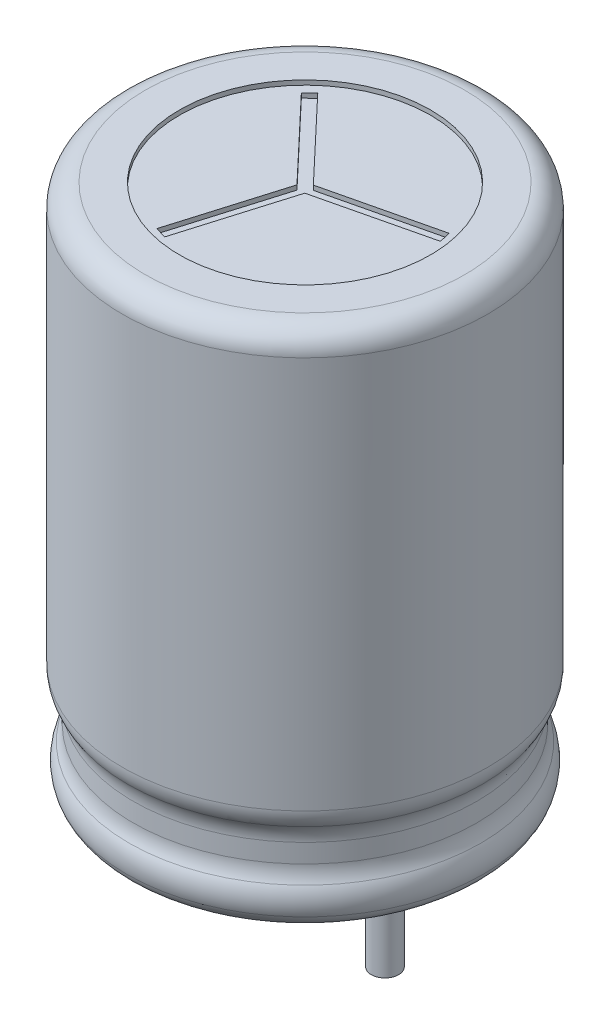
ISO-10303-21;
HEADER;
FILE_DESCRIPTION(('STEP AP214'),'2;1');
FILE_NAME('part.step','',(''),(''),'','','');
FILE_SCHEMA(('AUTOMOTIVE_DESIGN { 1 0 10303 214 1 1 1 1 }'));
ENDSEC;
DATA;
#1=APPLICATION_CONTEXT('core data for automotive mechanical design processes');
#2=APPLICATION_PROTOCOL_DEFINITION('international standard','automotive_design',2000,#1);
#3=PRODUCT_CONTEXT('',#1,'mechanical');
#4=PRODUCT('Part','Part','',(#3));
#5=PRODUCT_RELATED_PRODUCT_CATEGORY('part','',(#4));
#6=PRODUCT_DEFINITION_FORMATION('','',#4);
#7=PRODUCT_DEFINITION_CONTEXT('part definition',#1,'design');
#8=PRODUCT_DEFINITION('design','',#6,#7);
#9=PRODUCT_DEFINITION_SHAPE('','',#8);
#10=(LENGTH_UNIT() NAMED_UNIT(*) SI_UNIT(.MILLI.,.METRE.));
#11=(NAMED_UNIT(*) PLANE_ANGLE_UNIT() SI_UNIT($,.RADIAN.));
#12=(NAMED_UNIT(*) SI_UNIT($,.STERADIAN.) SOLID_ANGLE_UNIT());
#13=UNCERTAINTY_MEASURE_WITH_UNIT(LENGTH_MEASURE(1.E-05),#10,'distance_accuracy_value','');
#14=(GEOMETRIC_REPRESENTATION_CONTEXT(3) GLOBAL_UNCERTAINTY_ASSIGNED_CONTEXT((#13)) GLOBAL_UNIT_ASSIGNED_CONTEXT((#10,
#11,#12)) REPRESENTATION_CONTEXT('',''));
#15=CARTESIAN_POINT('',(0.,0.,0.));
#16=DIRECTION('',(0.,0.,1.));
#17=DIRECTION('',(1.,0.,0.));
#18=AXIS2_PLACEMENT_3D('',#15,#16,#17);
#19=CARTESIAN_POINT('',(0.,11.5,0.));
#20=DIRECTION('',(0.,-1.,0.));
#21=DIRECTION('',(1.,0.,0.));
#22=AXIS2_PLACEMENT_3D('',#19,#20,#21);
#23=CYLINDRICAL_SURFACE('',#22,4.);
#24=CARTESIAN_POINT('',(0.,11.,0.));
#25=DIRECTION('',(0.,1.,0.));
#26=DIRECTION('',(-1.,0.,0.));
#27=AXIS2_PLACEMENT_3D('',#24,#25,#26);
#28=CIRCLE('',#27,4.);
#29=CARTESIAN_POINT('',(-4.,11.,0.));
#30=VERTEX_POINT('',#29);
#31=EDGE_CURVE('E203',#30,#30,#28,.F.);
#32=ORIENTED_EDGE('',*,*,#31,.T.);
#33=EDGE_LOOP('',(#32));
#34=FACE_BOUND('',#33,.T.);
#35=CARTESIAN_POINT('',(0.,2.40756880196224,0.));
#36=DIRECTION('',(0.,-1.,0.));
#37=DIRECTION('',(1.,0.,0.));
#38=AXIS2_PLACEMENT_3D('',#35,#36,#37);
#39=CIRCLE('',#38,4.);
#40=CARTESIAN_POINT('',(4.,2.40756880196224,0.));
#41=VERTEX_POINT('',#40);
#42=EDGE_CURVE('E180',#41,#41,#39,.T.);
#43=ORIENTED_EDGE('',*,*,#42,.F.);
#44=EDGE_LOOP('',(#43));
#45=FACE_BOUND('',#44,.T.);
#46=ADVANCED_FACE('F35',(#34,#45),#23,.T.);
#47=CARTESIAN_POINT('',(4.,11.5,0.));
#48=DIRECTION('',(0.,1.,0.));
#49=DIRECTION('',(-1.,0.,0.));
#50=AXIS2_PLACEMENT_3D('',#47,#48,#49);
#51=PLANE('',#50);
#52=CARTESIAN_POINT('',(0.,11.5,0.));
#53=DIRECTION('',(0.,1.,0.));
#54=DIRECTION('',(-1.,0.,0.));
#55=AXIS2_PLACEMENT_3D('',#52,#53,#54);
#56=CIRCLE('',#55,3.5);
#57=CARTESIAN_POINT('',(-3.5,11.5,0.));
#58=VERTEX_POINT('',#57);
#59=EDGE_CURVE('E206',#58,#58,#56,.T.);
#60=ORIENTED_EDGE('',*,*,#59,.T.);
#61=EDGE_LOOP('',(#60));
#62=FACE_BOUND('',#61,.T.);
#63=CARTESIAN_POINT('',(0.,11.5,0.));
#64=DIRECTION('',(0.,1.,0.));
#65=DIRECTION('',(0.,0.,-1.));
#66=AXIS2_PLACEMENT_3D('',#63,#64,#65);
#67=CIRCLE('',#66,2.75);
#68=CARTESIAN_POINT('',(0.,11.5,-2.75));
#69=VERTEX_POINT('',#68);
#70=EDGE_CURVE('E165',#69,#69,#67,.T.);
#71=ORIENTED_EDGE('',*,*,#70,.F.);
#72=EDGE_LOOP('',(#71));
#73=FACE_BOUND('',#72,.T.);
#74=ADVANCED_FACE('F224',(#62,#73),#51,.T.);
#75=CARTESIAN_POINT('',(0.,0.,0.));
#76=DIRECTION('',(0.,-1.,0.));
#77=DIRECTION('',(1.,0.,0.));
#78=AXIS2_PLACEMENT_3D('',#75,#76,#77);
#79=PLANE('',#78);
#80=CARTESIAN_POINT('',(0.,0.,0.));
#81=DIRECTION('',(0.,-1.,0.));
#82=DIRECTION('',(1.,0.,0.));
#83=AXIS2_PLACEMENT_3D('',#80,#81,#82);
#84=CIRCLE('',#83,3.43222217734238);
#85=CARTESIAN_POINT('',(3.43222217734238,0.,0.));
#86=VERTEX_POINT('',#85);
#87=EDGE_CURVE('E43',#86,#86,#84,.T.);
#88=ORIENTED_EDGE('',*,*,#87,.T.);
#89=EDGE_LOOP('',(#88));
#90=FACE_BOUND('',#89,.T.);
#91=CARTESIAN_POINT('',(-1.75,0.,0.));
#92=DIRECTION('',(0.,-1.,0.));
#93=DIRECTION('',(1.,0.,0.));
#94=AXIS2_PLACEMENT_3D('',#91,#92,#93);
#95=CIRCLE('',#94,0.3);
#96=CARTESIAN_POINT('',(-1.45,0.,0.));
#97=VERTEX_POINT('',#96);
#98=EDGE_CURVE('E200',#97,#97,#95,.T.);
#99=ORIENTED_EDGE('',*,*,#98,.F.);
#100=EDGE_LOOP('',(#99));
#101=FACE_BOUND('',#100,.T.);
#102=CARTESIAN_POINT('',(1.75,0.,0.));
#103=DIRECTION('',(0.,-1.,0.));
#104=DIRECTION('',(1.,0.,0.));
#105=AXIS2_PLACEMENT_3D('',#102,#103,#104);
#106=CIRCLE('',#105,0.3);
#107=CARTESIAN_POINT('',(2.05,0.,0.));
#108=VERTEX_POINT('',#107);
#109=EDGE_CURVE('E197',#108,#108,#106,.T.);
#110=ORIENTED_EDGE('',*,*,#109,.F.);
#111=EDGE_LOOP('',(#110));
#112=FACE_BOUND('',#111,.T.);
#113=ADVANCED_FACE('F211',(#90,#101,#112),#79,.T.);
#114=CARTESIAN_POINT('',(0.,0.557977491137765,0.));
#115=DIRECTION('',(0.,-1.,0.));
#116=DIRECTION('',(1.,0.,0.));
#117=AXIS2_PLACEMENT_3D('',#114,#115,#116);
#118=TOROIDAL_SURFACE('',#117,3.27152793880487,0.670833333333335);
#119=CARTESIAN_POINT('',(0.,0.330309782035807,0.));
#120=DIRECTION('',(0.,1.,0.));
#121=DIRECTION('',(-1.,0.,0.));
#122=AXIS2_PLACEMENT_3D('',#119,#120,#121);
#123=CIRCLE('',#122,3.90254677793996);
#124=CARTESIAN_POINT('',(-3.90254677793995,0.330309782035806,0.));
#125=VERTEX_POINT('',#124);
#126=EDGE_CURVE('E11',#125,#125,#123,.T.);
#127=ORIENTED_EDGE('',*,*,#126,.T.);
#128=EDGE_LOOP('',(#127));
#129=FACE_BOUND('',#128,.T.);
#130=CARTESIAN_POINT('',(0.,0.895288247422594,0.));
#131=DIRECTION('',(0.,-1.,0.));
#132=DIRECTION('',(1.,0.,0.));
#133=AXIS2_PLACEMENT_3D('',#130,#131,#132);
#134=CIRCLE('',#133,3.85138896940244);
#135=CARTESIAN_POINT('',(3.85138896940244,0.895288247422594,0.));
#136=VERTEX_POINT('',#135);
#137=EDGE_CURVE('E194',#136,#136,#134,.T.);
#138=ORIENTED_EDGE('',*,*,#137,.T.);
#139=EDGE_LOOP('',(#138));
#140=FACE_BOUND('',#139,.T.);
#141=ADVANCED_FACE('F236',(#129,#140),#118,.T.);
#142=CARTESIAN_POINT('',(0.,1.23259900370742,0.));
#143=DIRECTION('',(0.,-1.,0.));
#144=DIRECTION('',(1.,0.,0.));
#145=AXIS2_PLACEMENT_3D('',#142,#143,#144);
#146=TOROIDAL_SURFACE('',#145,4.43125,0.670833333333332);
#147=CARTESIAN_POINT('',(0.,1.23259900370742,0.));
#148=DIRECTION('',(0.,-1.,0.));
#149=DIRECTION('',(1.,0.,0.));
#150=AXIS2_PLACEMENT_3D('',#147,#148,#149);
#151=CIRCLE('',#150,3.76041666666667);
#152=CARTESIAN_POINT('',(3.76041666666667,1.23259900370742,0.));
#153=VERTEX_POINT('',#152);
#154=EDGE_CURVE('E191',#153,#153,#151,.T.);
#155=ORIENTED_EDGE('',*,*,#154,.T.);
#156=EDGE_LOOP('',(#155));
#157=FACE_BOUND('',#156,.T.);
#158=ORIENTED_EDGE('',*,*,#137,.F.);
#159=EDGE_LOOP('',(#158));
#160=FACE_BOUND('',#159,.T.);
#161=ADVANCED_FACE('F239',(#157,#160),#146,.F.);
#162=CARTESIAN_POINT('',(0.,11.5,0.));
#163=DIRECTION('',(0.,-1.,0.));
#164=DIRECTION('',(1.,0.,0.));
#165=AXIS2_PLACEMENT_3D('',#162,#163,#164);
#166=CYLINDRICAL_SURFACE('',#165,3.76041666666667);
#167=CARTESIAN_POINT('',(0.,1.64240099629258,0.));
#168=DIRECTION('',(0.,-1.,0.));
#169=DIRECTION('',(1.,0.,0.));
#170=AXIS2_PLACEMENT_3D('',#167,#168,#169);
#171=CIRCLE('',#170,3.76041666666667);
#172=CARTESIAN_POINT('',(3.76041666666667,1.64240099629258,0.));
#173=VERTEX_POINT('',#172);
#174=EDGE_CURVE('E188',#173,#173,#171,.T.);
#175=ORIENTED_EDGE('',*,*,#174,.T.);
#176=EDGE_LOOP('',(#175));
#177=FACE_BOUND('',#176,.T.);
#178=ORIENTED_EDGE('',*,*,#154,.F.);
#179=EDGE_LOOP('',(#178));
#180=FACE_BOUND('',#179,.T.);
#181=ADVANCED_FACE('F243',(#177,#180),#166,.T.);
#182=CARTESIAN_POINT('',(0.,1.64240099629258,0.));
#183=DIRECTION('',(0.,-1.,0.));
#184=DIRECTION('',(1.,0.,0.));
#185=AXIS2_PLACEMENT_3D('',#182,#183,#184);
#186=TOROIDAL_SURFACE('',#185,4.43125,0.670833333333335);
#187=CARTESIAN_POINT('',(0.,2.02498489912741,0.));
#188=DIRECTION('',(0.,-1.,0.));
#189=DIRECTION('',(1.,0.,0.));
#190=AXIS2_PLACEMENT_3D('',#187,#188,#189);
#191=CIRCLE('',#190,3.88020833333333);
#192=CARTESIAN_POINT('',(3.88020833333333,2.02498489912741,0.));
#193=VERTEX_POINT('',#192);
#194=EDGE_CURVE('E185',#193,#193,#191,.T.);
#195=ORIENTED_EDGE('',*,*,#194,.T.);
#196=EDGE_LOOP('',(#195));
#197=FACE_BOUND('',#196,.T.);
#198=ORIENTED_EDGE('',*,*,#174,.F.);
#199=EDGE_LOOP('',(#198));
#200=FACE_BOUND('',#199,.T.);
#201=ADVANCED_FACE('F247',(#197,#200),#186,.F.);
#202=CARTESIAN_POINT('',(0.,2.40756880196224,0.));
#203=DIRECTION('',(0.,-1.,0.));
#204=DIRECTION('',(1.,0.,0.));
#205=AXIS2_PLACEMENT_3D('',#202,#203,#204);
#206=TOROIDAL_SURFACE('',#205,3.32916666666667,0.670833333333331);
#207=ORIENTED_EDGE('',*,*,#42,.T.);
#208=EDGE_LOOP('',(#207));
#209=FACE_BOUND('',#208,.T.);
#210=ORIENTED_EDGE('',*,*,#194,.F.);
#211=EDGE_LOOP('',(#210));
#212=FACE_BOUND('',#211,.T.);
#213=ADVANCED_FACE('F251',(#209,#212),#206,.T.);
#214=CARTESIAN_POINT('',(0.,11.4,0.));
#215=DIRECTION('',(0.,1.,0.));
#216=DIRECTION('',(0.,0.,1.));
#217=AXIS2_PLACEMENT_3D('',#214,#215,#216);
#218=CYLINDRICAL_SURFACE('',#217,2.75);
#219=CARTESIAN_POINT('',(0.,11.4,0.));
#220=DIRECTION('',(0.,1.,0.));
#221=DIRECTION('',(0.,0.,-1.));
#222=AXIS2_PLACEMENT_3D('',#219,#220,#221);
#223=CIRCLE('',#222,2.75);
#224=CARTESIAN_POINT('',(0.,11.4,-2.75));
#225=VERTEX_POINT('',#224);
#226=EDGE_CURVE('E177',#225,#225,#223,.T.);
#227=ORIENTED_EDGE('',*,*,#226,.F.);
#228=EDGE_LOOP('',(#227));
#229=FACE_BOUND('',#228,.T.);
#230=ORIENTED_EDGE('',*,*,#70,.T.);
#231=EDGE_LOOP('',(#230));
#232=FACE_BOUND('',#231,.T.);
#233=ADVANCED_FACE('F255',(#229,#232),#218,.F.);
#234=CARTESIAN_POINT('',(0.,11.4,0.));
#235=DIRECTION('',(0.,-1.,0.));
#236=DIRECTION('',(0.,0.,-1.));
#237=AXIS2_PLACEMENT_3D('',#234,#235,#236);
#238=PLANE('',#237);
#239=DIRECTION('',(-0.72638071356326,0.,0.687292557040545));
#240=VECTOR('',#239,1.);
#241=CARTESIAN_POINT('',(-1.65347274426045,11.4,-1.93229316719483));
#242=LINE('',#241,#240);
#243=CARTESIAN_POINT('',(-1.65347274426045,11.4,-1.93229316719483));
#244=VERTEX_POINT('',#243);
#245=CARTESIAN_POINT('',(-1.83797344550552,11.4,-1.75772085770653));
#246=VERTEX_POINT('',#245);
#247=EDGE_CURVE('E142',#244,#246,#242,.T.);
#248=ORIENTED_EDGE('',*,*,#247,.F.);
#249=DIRECTION('',(-0.687292557040545,0.,-0.726380713563259));
#250=VECTOR('',#249,1.);
#251=CARTESIAN_POINT('',(0.0418556656844723,11.4,-0.140546919508906));
#252=LINE('',#251,#250);
#253=CARTESIAN_POINT('',(0.0418556656844723,11.4,-0.140546919508906));
#254=VERTEX_POINT('',#253);
#255=EDGE_CURVE('E50',#254,#244,#252,.T.);
#256=ORIENTED_EDGE('',*,*,#255,.F.);
#257=DIRECTION('',(-0.972710429285124,0.,0.232022457447443));
#258=VECTOR('',#257,1.);
#259=CARTESIAN_POINT('',(2.44121763828839,11.4,-0.712871266435717));
#260=LINE('',#259,#258);
#261=CARTESIAN_POINT('',(2.44121763828839,11.4,-0.712871266435717));
#262=VERTEX_POINT('',#261);
#263=EDGE_CURVE('E161',#262,#254,#260,.T.);
#264=ORIENTED_EDGE('',*,*,#263,.F.);
#265=DIRECTION('',(-0.232022457447444,0.,-0.972710429285123));
#266=VECTOR('',#265,1.);
#267=CARTESIAN_POINT('',(2.50015134248004,11.4,-0.465802817397295));
#268=LINE('',#267,#266);
#269=CARTESIAN_POINT('',(2.50015134248004,11.4,-0.465802817397295));
#270=VERTEX_POINT('',#269);
#271=EDGE_CURVE('E159',#270,#262,#268,.T.);
#272=ORIENTED_EDGE('',*,*,#271,.F.);
#273=DIRECTION('',(0.972710429285124,0.,-0.232022457447443));
#274=VECTOR('',#273,1.);
#275=CARTESIAN_POINT('',(0.100789369876124,11.4,0.106521529529515));
#276=LINE('',#275,#274);
#277=CARTESIAN_POINT('',(0.100789369876124,11.4,0.106521529529515));
#278=VERTEX_POINT('',#277);
#279=EDGE_CURVE('E116',#278,#270,#276,.T.);
#280=ORIENTED_EDGE('',*,*,#279,.F.);
#281=DIRECTION('',(0.285417872244573,0.,-0.958403171010708));
#282=VECTOR('',#281,1.);
#283=CARTESIAN_POINT('',(-0.603244192782856,11.4,2.47059212414226));
#284=LINE('',#283,#282);
#285=CARTESIAN_POINT('',(-0.603244192782856,11.4,2.47059212414226));
#286=VERTEX_POINT('',#285);
#287=EDGE_CURVE('E155',#286,#278,#284,.T.);
#288=ORIENTED_EDGE('',*,*,#287,.F.);
#289=DIRECTION('',(0.958403171010708,0.,0.285417872244573));
#290=VECTOR('',#289,1.);
#291=CARTESIAN_POINT('',(-0.846678598219576,11.4,2.39809598459214));
#292=LINE('',#291,#290);
#293=CARTESIAN_POINT('',(-0.846678598219576,11.4,2.39809598459214));
#294=VERTEX_POINT('',#293);
#295=EDGE_CURVE('E152',#294,#286,#292,.T.);
#296=ORIENTED_EDGE('',*,*,#295,.F.);
#297=DIRECTION('',(-0.285417872244573,0.,0.958403171010708));
#298=VECTOR('',#297,1.);
#299=CARTESIAN_POINT('',(-0.142645035560596,11.4,0.0340253899793922));
#300=LINE('',#299,#298);
#301=CARTESIAN_POINT('',(-0.142645035560596,11.4,0.0340253899793922));
#302=VERTEX_POINT('',#301);
#303=EDGE_CURVE('E149',#302,#294,#300,.T.);
#304=ORIENTED_EDGE('',*,*,#303,.F.);
#305=DIRECTION('',(0.687292557040545,0.,0.726380713563259));
#306=VECTOR('',#305,1.);
#307=CARTESIAN_POINT('',(-1.83797344550552,11.4,-1.75772085770653));
#308=LINE('',#307,#306);
#309=EDGE_CURVE('E146',#246,#302,#308,.T.);
#310=ORIENTED_EDGE('',*,*,#309,.F.);
#311=EDGE_LOOP('',(#248,#256,#264,#272,#280,#288,#296,#304,#310));
#312=FACE_BOUND('',#311,.T.);
#313=ORIENTED_EDGE('',*,*,#226,.T.);
#314=EDGE_LOOP('',(#313));
#315=FACE_BOUND('',#314,.T.);
#316=ADVANCED_FACE('F259',(#312,#315),#238,.F.);
#317=CARTESIAN_POINT('',(0.0418556656844723,11.3,-0.140546919508906));
#318=DIRECTION('',(0.726380713563259,0.,-0.687292557040545));
#319=DIRECTION('',(-0.687292557040545,0.,-0.726380713563259));
#320=AXIS2_PLACEMENT_3D('',#317,#318,#319);
#321=PLANE('',#320);
#322=ORIENTED_EDGE('',*,*,#255,.T.);
#323=DIRECTION('',(0.,1.,0.));
#324=VECTOR('',#323,1.);
#325=CARTESIAN_POINT('',(-1.65347274426045,11.3,-1.93229316719483));
#326=LINE('',#325,#324);
#327=CARTESIAN_POINT('',(-1.65347274426045,11.3,-1.93229316719483));
#328=VERTEX_POINT('',#327);
#329=EDGE_CURVE('E89',#328,#244,#326,.T.);
#330=ORIENTED_EDGE('',*,*,#329,.F.);
#331=DIRECTION('',(-0.687292557040545,0.,-0.726380713563259));
#332=VECTOR('',#331,1.);
#333=CARTESIAN_POINT('',(0.0418556656844723,11.3,-0.140546919508906));
#334=LINE('',#333,#332);
#335=CARTESIAN_POINT('',(0.0418556656844723,11.3,-0.140546919508906));
#336=VERTEX_POINT('',#335);
#337=EDGE_CURVE('E163',#336,#328,#334,.T.);
#338=ORIENTED_EDGE('',*,*,#337,.F.);
#339=DIRECTION('',(0.,1.,0.));
#340=VECTOR('',#339,1.);
#341=CARTESIAN_POINT('',(0.0418556656844723,11.3,-0.140546919508906));
#342=LINE('',#341,#340);
#343=EDGE_CURVE('E58',#336,#254,#342,.T.);
#344=ORIENTED_EDGE('',*,*,#343,.T.);
#345=EDGE_LOOP('',(#322,#330,#338,#344));
#346=FACE_BOUND('',#345,.T.);
#347=ADVANCED_FACE('F263',(#346),#321,.F.);
#348=CARTESIAN_POINT('',(2.44121763828839,11.3,-0.712871266435717));
#349=DIRECTION('',(-0.232022457447443,0.,-0.972710429285124));
#350=DIRECTION('',(-0.972710429285124,0.,0.232022457447443));
#351=AXIS2_PLACEMENT_3D('',#348,#349,#350);
#352=PLANE('',#351);
#353=ORIENTED_EDGE('',*,*,#263,.T.);
#354=ORIENTED_EDGE('',*,*,#343,.F.);
#355=DIRECTION('',(-0.972710429285124,0.,0.232022457447443));
#356=VECTOR('',#355,1.);
#357=CARTESIAN_POINT('',(2.44121763828839,11.3,-0.712871266435717));
#358=LINE('',#357,#356);
#359=CARTESIAN_POINT('',(2.44121763828839,11.3,-0.712871266435717));
#360=VERTEX_POINT('',#359);
#361=EDGE_CURVE('E128',#360,#336,#358,.T.);
#362=ORIENTED_EDGE('',*,*,#361,.F.);
#363=DIRECTION('',(0.,1.,0.));
#364=VECTOR('',#363,1.);
#365=CARTESIAN_POINT('',(2.44121763828839,11.3,-0.712871266435717));
#366=LINE('',#365,#364);
#367=EDGE_CURVE('E120',#360,#262,#366,.T.);
#368=ORIENTED_EDGE('',*,*,#367,.T.);
#369=EDGE_LOOP('',(#353,#354,#362,#368));
#370=FACE_BOUND('',#369,.T.);
#371=ADVANCED_FACE('F267',(#370),#352,.F.);
#372=CARTESIAN_POINT('',(2.50015134248004,11.3,-0.465802817397295));
#373=DIRECTION('',(0.972710429285123,0.,-0.232022457447444));
#374=DIRECTION('',(-0.232022457447444,0.,-0.972710429285123));
#375=AXIS2_PLACEMENT_3D('',#372,#373,#374);
#376=PLANE('',#375);
#377=ORIENTED_EDGE('',*,*,#271,.T.);
#378=ORIENTED_EDGE('',*,*,#367,.F.);
#379=DIRECTION('',(-0.232022457447444,0.,-0.972710429285123));
#380=VECTOR('',#379,1.);
#381=CARTESIAN_POINT('',(2.50015134248004,11.3,-0.465802817397295));
#382=LINE('',#381,#380);
#383=CARTESIAN_POINT('',(2.50015134248004,11.3,-0.465802817397295));
#384=VERTEX_POINT('',#383);
#385=EDGE_CURVE('E124',#384,#360,#382,.T.);
#386=ORIENTED_EDGE('',*,*,#385,.F.);
#387=DIRECTION('',(0.,1.,0.));
#388=VECTOR('',#387,1.);
#389=CARTESIAN_POINT('',(2.50015134248004,11.3,-0.465802817397295));
#390=LINE('',#389,#388);
#391=EDGE_CURVE('E109',#384,#270,#390,.T.);
#392=ORIENTED_EDGE('',*,*,#391,.T.);
#393=EDGE_LOOP('',(#377,#378,#386,#392));
#394=FACE_BOUND('',#393,.T.);
#395=ADVANCED_FACE('F125',(#394),#376,.F.);
#396=CARTESIAN_POINT('',(0.100789369876124,11.3,0.106521529529515));
#397=DIRECTION('',(0.232022457447443,0.,0.972710429285124));
#398=DIRECTION('',(0.972710429285124,0.,-0.232022457447443));
#399=AXIS2_PLACEMENT_3D('',#396,#397,#398);
#400=PLANE('',#399);
#401=ORIENTED_EDGE('',*,*,#279,.T.);
#402=ORIENTED_EDGE('',*,*,#391,.F.);
#403=DIRECTION('',(0.972710429285124,0.,-0.232022457447443));
#404=VECTOR('',#403,1.);
#405=CARTESIAN_POINT('',(0.100789369876124,11.3,0.106521529529515));
#406=LINE('',#405,#404);
#407=CARTESIAN_POINT('',(0.100789369876124,11.3,0.106521529529515));
#408=VERTEX_POINT('',#407);
#409=EDGE_CURVE('E113',#408,#384,#406,.T.);
#410=ORIENTED_EDGE('',*,*,#409,.F.);
#411=DIRECTION('',(0.,1.,0.));
#412=VECTOR('',#411,1.);
#413=CARTESIAN_POINT('',(0.100789369876124,11.3,0.106521529529515));
#414=LINE('',#413,#412);
#415=EDGE_CURVE('E121',#408,#278,#414,.T.);
#416=ORIENTED_EDGE('',*,*,#415,.T.);
#417=EDGE_LOOP('',(#401,#402,#410,#416));
#418=FACE_BOUND('',#417,.T.);
#419=ADVANCED_FACE('F111',(#418),#400,.F.);
#420=CARTESIAN_POINT('',(-0.603244192782856,11.3,2.47059212414226));
#421=DIRECTION('',(0.958403171010708,0.,0.285417872244573));
#422=DIRECTION('',(0.285417872244573,0.,-0.958403171010708));
#423=AXIS2_PLACEMENT_3D('',#420,#421,#422);
#424=PLANE('',#423);
#425=ORIENTED_EDGE('',*,*,#287,.T.);
#426=ORIENTED_EDGE('',*,*,#415,.F.);
#427=DIRECTION('',(0.285417872244573,0.,-0.958403171010708));
#428=VECTOR('',#427,1.);
#429=CARTESIAN_POINT('',(-0.603244192782856,11.3,2.47059212414226));
#430=LINE('',#429,#428);
#431=CARTESIAN_POINT('',(-0.603244192782856,11.3,2.47059212414226));
#432=VERTEX_POINT('',#431);
#433=EDGE_CURVE('E134',#432,#408,#430,.T.);
#434=ORIENTED_EDGE('',*,*,#433,.F.);
#435=DIRECTION('',(0.,1.,0.));
#436=VECTOR('',#435,1.);
#437=CARTESIAN_POINT('',(-0.603244192782856,11.3,2.47059212414226));
#438=LINE('',#437,#436);
#439=EDGE_CURVE('E168',#432,#286,#438,.T.);
#440=ORIENTED_EDGE('',*,*,#439,.T.);
#441=EDGE_LOOP('',(#425,#426,#434,#440));
#442=FACE_BOUND('',#441,.T.);
#443=ADVANCED_FACE('F283',(#442),#424,.F.);
#444=CARTESIAN_POINT('',(-0.846678598219576,11.3,2.39809598459214));
#445=DIRECTION('',(-0.285417872244573,0.,0.958403171010708));
#446=DIRECTION('',(0.958403171010708,0.,0.285417872244573));
#447=AXIS2_PLACEMENT_3D('',#444,#445,#446);
#448=PLANE('',#447);
#449=ORIENTED_EDGE('',*,*,#295,.T.);
#450=ORIENTED_EDGE('',*,*,#439,.F.);
#451=DIRECTION('',(0.958403171010708,0.,0.285417872244573));
#452=VECTOR('',#451,1.);
#453=CARTESIAN_POINT('',(-0.846678598219576,11.3,2.39809598459214));
#454=LINE('',#453,#452);
#455=CARTESIAN_POINT('',(-0.846678598219576,11.3,2.39809598459214));
#456=VERTEX_POINT('',#455);
#457=EDGE_CURVE('E136',#456,#432,#454,.T.);
#458=ORIENTED_EDGE('',*,*,#457,.F.);
#459=DIRECTION('',(0.,1.,0.));
#460=VECTOR('',#459,1.);
#461=CARTESIAN_POINT('',(-0.846678598219576,11.3,2.39809598459214));
#462=LINE('',#461,#460);
#463=EDGE_CURVE('E170',#456,#294,#462,.T.);
#464=ORIENTED_EDGE('',*,*,#463,.T.);
#465=EDGE_LOOP('',(#449,#450,#458,#464));
#466=FACE_BOUND('',#465,.T.);
#467=ADVANCED_FACE('F279',(#466),#448,.F.);
#468=CARTESIAN_POINT('',(-0.142645035560596,11.3,0.0340253899793922));
#469=DIRECTION('',(-0.958403171010708,0.,-0.285417872244573));
#470=DIRECTION('',(-0.285417872244573,0.,0.958403171010708));
#471=AXIS2_PLACEMENT_3D('',#468,#469,#470);
#472=PLANE('',#471);
#473=ORIENTED_EDGE('',*,*,#303,.T.);
#474=ORIENTED_EDGE('',*,*,#463,.F.);
#475=DIRECTION('',(-0.285417872244573,0.,0.958403171010708));
#476=VECTOR('',#475,1.);
#477=CARTESIAN_POINT('',(-0.142645035560596,11.3,0.0340253899793922));
#478=LINE('',#477,#476);
#479=CARTESIAN_POINT('',(-0.142645035560596,11.3,0.0340253899793922));
#480=VERTEX_POINT('',#479);
#481=EDGE_CURVE('E326',#480,#456,#478,.T.);
#482=ORIENTED_EDGE('',*,*,#481,.F.);
#483=DIRECTION('',(0.,1.,0.));
#484=VECTOR('',#483,1.);
#485=CARTESIAN_POINT('',(-0.142645035560596,11.3,0.0340253899793922));
#486=LINE('',#485,#484);
#487=EDGE_CURVE('E172',#480,#302,#486,.T.);
#488=ORIENTED_EDGE('',*,*,#487,.T.);
#489=EDGE_LOOP('',(#473,#474,#482,#488));
#490=FACE_BOUND('',#489,.T.);
#491=ADVANCED_FACE('F275',(#490),#472,.F.);
#492=CARTESIAN_POINT('',(-1.83797344550552,11.3,-1.75772085770653));
#493=DIRECTION('',(-0.726380713563259,0.,0.687292557040545));
#494=DIRECTION('',(0.687292557040545,0.,0.726380713563259));
#495=AXIS2_PLACEMENT_3D('',#492,#493,#494);
#496=PLANE('',#495);
#497=ORIENTED_EDGE('',*,*,#309,.T.);
#498=ORIENTED_EDGE('',*,*,#487,.F.);
#499=DIRECTION('',(0.687292557040545,0.,0.726380713563259));
#500=VECTOR('',#499,1.);
#501=CARTESIAN_POINT('',(-1.83797344550552,11.3,-1.75772085770653));
#502=LINE('',#501,#500);
#503=CARTESIAN_POINT('',(-1.83797344550552,11.3,-1.75772085770653));
#504=VERTEX_POINT('',#503);
#505=EDGE_CURVE('E323',#504,#480,#502,.T.);
#506=ORIENTED_EDGE('',*,*,#505,.F.);
#507=DIRECTION('',(0.,1.,0.));
#508=VECTOR('',#507,1.);
#509=CARTESIAN_POINT('',(-1.83797344550552,11.3,-1.75772085770653));
#510=LINE('',#509,#508);
#511=EDGE_CURVE('E174',#504,#246,#510,.T.);
#512=ORIENTED_EDGE('',*,*,#511,.T.);
#513=EDGE_LOOP('',(#497,#498,#506,#512));
#514=FACE_BOUND('',#513,.T.);
#515=ADVANCED_FACE('F271',(#514),#496,.F.);
#516=CARTESIAN_POINT('',(-1.65347274426045,11.3,-1.93229316719483));
#517=DIRECTION('',(-0.687292557040544,0.,-0.72638071356326));
#518=DIRECTION('',(-0.72638071356326,0.,0.687292557040544));
#519=AXIS2_PLACEMENT_3D('',#516,#517,#518);
#520=PLANE('',#519);
#521=ORIENTED_EDGE('',*,*,#247,.T.);
#522=ORIENTED_EDGE('',*,*,#511,.F.);
#523=DIRECTION('',(-0.72638071356326,0.,0.687292557040545));
#524=VECTOR('',#523,1.);
#525=CARTESIAN_POINT('',(-1.65347274426045,11.3,-1.93229316719483));
#526=LINE('',#525,#524);
#527=EDGE_CURVE('E320',#328,#504,#526,.T.);
#528=ORIENTED_EDGE('',*,*,#527,.F.);
#529=ORIENTED_EDGE('',*,*,#329,.T.);
#530=EDGE_LOOP('',(#521,#522,#528,#529));
#531=FACE_BOUND('',#530,.T.);
#532=ADVANCED_FACE('F268',(#531),#520,.F.);
#533=CARTESIAN_POINT('',(0.,11.3,0.));
#534=DIRECTION('',(0.,1.,0.));
#535=DIRECTION('',(0.,0.,1.));
#536=AXIS2_PLACEMENT_3D('',#533,#534,#535);
#537=PLANE('',#536);
#538=ORIENTED_EDGE('',*,*,#337,.T.);
#539=ORIENTED_EDGE('',*,*,#527,.T.);
#540=ORIENTED_EDGE('',*,*,#505,.T.);
#541=ORIENTED_EDGE('',*,*,#481,.T.);
#542=ORIENTED_EDGE('',*,*,#457,.T.);
#543=ORIENTED_EDGE('',*,*,#433,.T.);
#544=ORIENTED_EDGE('',*,*,#409,.T.);
#545=ORIENTED_EDGE('',*,*,#385,.T.);
#546=ORIENTED_EDGE('',*,*,#361,.T.);
#547=EDGE_LOOP('',(#538,#539,#540,#541,#542,#543,#544,#545,#546));
#548=FACE_BOUND('',#547,.T.);
#549=ADVANCED_FACE('F131',(#548),#537,.T.);
#550=CARTESIAN_POINT('',(1.75,-2.5,0.));
#551=DIRECTION('',(0.,1.,0.));
#552=DIRECTION('',(0.,0.,1.));
#553=AXIS2_PLACEMENT_3D('',#550,#551,#552);
#554=CYLINDRICAL_SURFACE('',#553,0.3);
#555=CARTESIAN_POINT('',(1.75,-2.5,0.));
#556=DIRECTION('',(0.,1.,0.));
#557=DIRECTION('',(0.,0.,1.));
#558=AXIS2_PLACEMENT_3D('',#555,#556,#557);
#559=CIRCLE('',#558,0.3);
#560=CARTESIAN_POINT('',(1.75,-2.5,0.3));
#561=VERTEX_POINT('',#560);
#562=EDGE_CURVE('E143',#561,#561,#559,.T.);
#563=ORIENTED_EDGE('',*,*,#562,.T.);
#564=EDGE_LOOP('',(#563));
#565=FACE_BOUND('',#564,.T.);
#566=ORIENTED_EDGE('',*,*,#109,.T.);
#567=EDGE_LOOP('',(#566));
#568=FACE_BOUND('',#567,.T.);
#569=ADVANCED_FACE('F296',(#565,#568),#554,.T.);
#570=CARTESIAN_POINT('',(2.05,-2.5,0.));
#571=DIRECTION('',(0.,-1.,0.));
#572=DIRECTION('',(0.,0.,-1.));
#573=AXIS2_PLACEMENT_3D('',#570,#571,#572);
#574=PLANE('',#573);
#575=ORIENTED_EDGE('',*,*,#562,.F.);
#576=EDGE_LOOP('',(#575));
#577=FACE_BOUND('',#576,.T.);
#578=ADVANCED_FACE('F299',(#577),#574,.T.);
#579=CARTESIAN_POINT('',(-1.75,-2.5,0.));
#580=DIRECTION('',(0.,1.,0.));
#581=DIRECTION('',(0.,0.,1.));
#582=AXIS2_PLACEMENT_3D('',#579,#580,#581);
#583=CYLINDRICAL_SURFACE('',#582,0.3);
#584=CARTESIAN_POINT('',(-1.75,-2.5,0.));
#585=DIRECTION('',(0.,1.,0.));
#586=DIRECTION('',(0.,0.,1.));
#587=AXIS2_PLACEMENT_3D('',#584,#585,#586);
#588=CIRCLE('',#587,0.3);
#589=CARTESIAN_POINT('',(-1.75,-2.5,0.3));
#590=VERTEX_POINT('',#589);
#591=EDGE_CURVE('E314',#590,#590,#588,.T.);
#592=ORIENTED_EDGE('',*,*,#591,.T.);
#593=EDGE_LOOP('',(#592));
#594=FACE_BOUND('',#593,.T.);
#595=ORIENTED_EDGE('',*,*,#98,.T.);
#596=EDGE_LOOP('',(#595));
#597=FACE_BOUND('',#596,.T.);
#598=ADVANCED_FACE('F303',(#594,#597),#583,.T.);
#599=CARTESIAN_POINT('',(-1.45,-2.5,0.));
#600=DIRECTION('',(0.,-1.,0.));
#601=DIRECTION('',(0.,0.,-1.));
#602=AXIS2_PLACEMENT_3D('',#599,#600,#601);
#603=PLANE('',#602);
#604=ORIENTED_EDGE('',*,*,#591,.F.);
#605=EDGE_LOOP('',(#604));
#606=FACE_BOUND('',#605,.T.);
#607=ADVANCED_FACE('F220',(#606),#603,.T.);
#608=CARTESIAN_POINT('',(0.,11.,0.));
#609=DIRECTION('',(0.,1.,0.));
#610=DIRECTION('',(-1.,0.,0.));
#611=AXIS2_PLACEMENT_3D('',#608,#609,#610);
#612=TOROIDAL_SURFACE('',#611,3.5,0.5);
#613=ORIENTED_EDGE('',*,*,#59,.F.);
#614=EDGE_LOOP('',(#613));
#615=FACE_BOUND('',#614,.T.);
#616=ORIENTED_EDGE('',*,*,#31,.F.);
#617=EDGE_LOOP('',(#616));
#618=FACE_BOUND('',#617,.T.);
#619=ADVANCED_FACE('F215',(#615,#618),#612,.T.);
#620=CARTESIAN_POINT('',(0.,0.5,0.));
#621=DIRECTION('',(0.,-1.,0.));
#622=DIRECTION('',(1.,0.,0.));
#623=AXIS2_PLACEMENT_3D('',#620,#621,#622);
#624=TOROIDAL_SURFACE('',#623,3.43222217734238,0.5);
#625=ORIENTED_EDGE('',*,*,#126,.F.);
#626=EDGE_LOOP('',(#625));
#627=FACE_BOUND('',#626,.T.);
#628=ORIENTED_EDGE('',*,*,#87,.F.);
#629=EDGE_LOOP('',(#628));
#630=FACE_BOUND('',#629,.T.);
#631=ADVANCED_FACE('F37',(#627,#630),#624,.T.);
#632=CLOSED_SHELL('',(#46,#74,#113,#141,#161,#181,#201,#213,#233,#316,#347,#371,#395,#419,#443,
#467,#491,#515,#532,#549,#569,#578,#598,#607,#619,#631));
#633=MANIFOLD_SOLID_BREP('B2',#632);
#634=ADVANCED_BREP_SHAPE_REPRESENTATION('',(#18,#633),#14);
#635=SHAPE_DEFINITION_REPRESENTATION(#9,#634);
ENDSEC;
END-ISO-10303-21;
